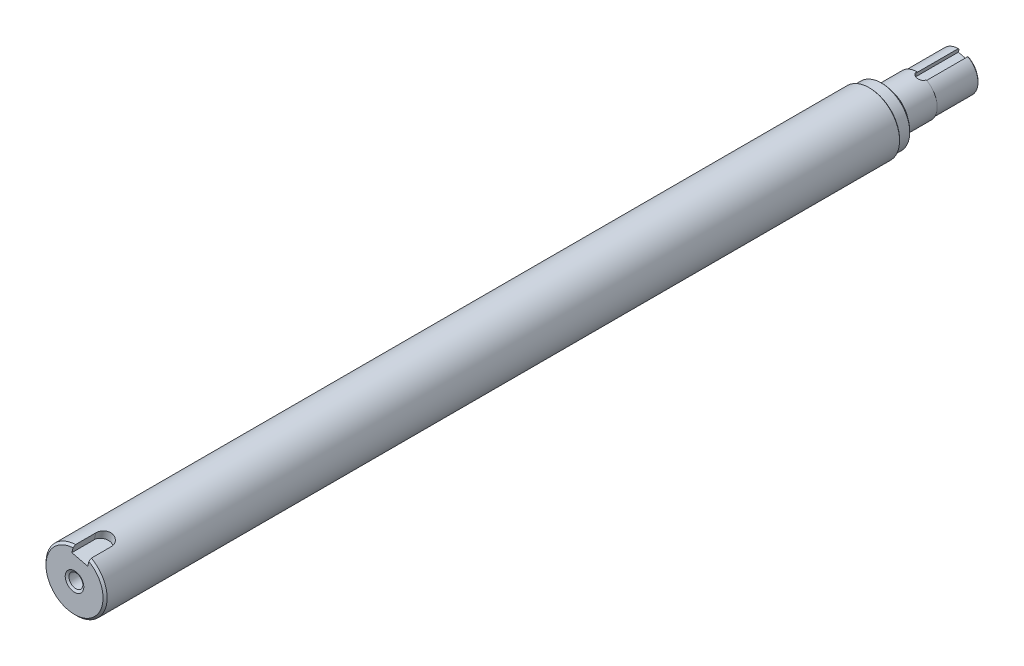
ISO-10303-21;
HEADER;
FILE_DESCRIPTION(('STEP AP214'),'2;1');
FILE_NAME('part.step','',(''),(''),'','','');
FILE_SCHEMA(('AUTOMOTIVE_DESIGN { 1 0 10303 214 1 1 1 1 }'));
ENDSEC;
DATA;
#1=APPLICATION_CONTEXT('core data for automotive mechanical design processes');
#2=APPLICATION_PROTOCOL_DEFINITION('international standard','automotive_design',2000,#1);
#3=PRODUCT_CONTEXT('',#1,'mechanical');
#4=PRODUCT('Part','Part','',(#3));
#5=PRODUCT_RELATED_PRODUCT_CATEGORY('part','',(#4));
#6=PRODUCT_DEFINITION_FORMATION('','',#4);
#7=PRODUCT_DEFINITION_CONTEXT('part definition',#1,'design');
#8=PRODUCT_DEFINITION('design','',#6,#7);
#9=PRODUCT_DEFINITION_SHAPE('','',#8);
#10=(LENGTH_UNIT() NAMED_UNIT(*) SI_UNIT(.MILLI.,.METRE.));
#11=(NAMED_UNIT(*) PLANE_ANGLE_UNIT() SI_UNIT($,.RADIAN.));
#12=(NAMED_UNIT(*) SI_UNIT($,.STERADIAN.) SOLID_ANGLE_UNIT());
#13=UNCERTAINTY_MEASURE_WITH_UNIT(LENGTH_MEASURE(1.E-05),#10,'distance_accuracy_value','');
#14=(GEOMETRIC_REPRESENTATION_CONTEXT(3) GLOBAL_UNCERTAINTY_ASSIGNED_CONTEXT((#13)) GLOBAL_UNIT_ASSIGNED_CONTEXT((#10,
#11,#12)) REPRESENTATION_CONTEXT('',''));
#15=CARTESIAN_POINT('',(0.,0.,0.));
#16=DIRECTION('',(0.,0.,1.));
#17=DIRECTION('',(1.,0.,0.));
#18=AXIS2_PLACEMENT_3D('',#15,#16,#17);
#19=CARTESIAN_POINT('',(521.923120033733,395.355248277508,-133.35));
#20=DIRECTION('',(0.,0.,1.));
#21=DIRECTION('',(1.,0.,0.));
#22=AXIS2_PLACEMENT_3D('',#19,#20,#21);
#23=PLANE('',#22);
#24=DIRECTION('',(0.234780935456965,0.972048307619509,0.));
#25=VECTOR('',#24,1.);
#26=CARTESIAN_POINT('',(475.867309140277,411.989768823581,-133.35));
#27=LINE('',#26,#25);
#28=CARTESIAN_POINT('',(475.867309140277,411.989768823581,-133.35));
#29=VERTEX_POINT('',#28);
#30=CARTESIAN_POINT('',(476.233688413175,413.50666520818,-133.35));
#31=VERTEX_POINT('',#30);
#32=EDGE_CURVE('E81',#29,#31,#27,.T.);
#33=ORIENTED_EDGE('',*,*,#32,.F.);
#34=DIRECTION('',(-0.972048307619508,0.234780935456973,0.));
#35=VECTOR('',#34,1.);
#36=CARTESIAN_POINT('',(475.867309140277,411.989768823581,-133.35));
#37=LINE('',#36,#35);
#38=CARTESIAN_POINT('',(480.496689205315,410.871624618467,-133.350000000002));
#39=VERTEX_POINT('',#38);
#40=EDGE_CURVE('E227',#39,#29,#37,.T.);
#41=ORIENTED_EDGE('',*,*,#40,.F.);
#42=DIRECTION('',(-0.23478093545618,-0.972048307619699,0.));
#43=VECTOR('',#42,1.);
#44=CARTESIAN_POINT('',(480.863068478212,412.388521003067,-133.35));
#45=LINE('',#44,#43);
#46=CARTESIAN_POINT('',(480.863068478213,412.388521003067,-133.35));
#47=VERTEX_POINT('',#46);
#48=EDGE_CURVE('E234',#47,#39,#45,.T.);
#49=ORIENTED_EDGE('',*,*,#48,.F.);
#50=CARTESIAN_POINT('',(476.510652388512,404.510927831157,-133.35));
#51=DIRECTION('',(0.,0.,1.));
#52=DIRECTION('',(1.,0.,0.));
#53=AXIS2_PLACEMENT_3D('',#50,#51,#52);
#54=CIRCLE('',#53,9.00000000000006);
#55=EDGE_CURVE('E19',#31,#47,#54,.T.);
#56=ORIENTED_EDGE('',*,*,#55,.F.);
#57=EDGE_LOOP('',(#33,#41,#49,#56));
#58=FACE_BOUND('',#57,.T.);
#59=ADVANCED_FACE('F16',(#58),#23,.F.);
#60=CARTESIAN_POINT('',(476.510652388512,404.510927831157,-132.85));
#61=DIRECTION('',(0.,0.,1.));
#62=DIRECTION('',(1.,0.,0.));
#63=AXIS2_PLACEMENT_3D('',#60,#61,#62);
#64=CONICAL_SURFACE('',#63,9.50000000000012,0.785398163397448);
#65=CARTESIAN_POINT('',(476.510652388512,404.510927831157,-132.85));
#66=DIRECTION('',(0.,0.,-1.));
#67=DIRECTION('',(-1.,0.,0.));
#68=AXIS2_PLACEMENT_3D('',#65,#66,#67);
#69=CIRCLE('',#68,9.5);
#70=CARTESIAN_POINT('',(476.355176748988,414.00965549993,-132.85));
#71=VERTEX_POINT('',#70);
#72=CARTESIAN_POINT('',(480.984556814026,412.891511294817,-132.85));
#73=VERTEX_POINT('',#72);
#74=EDGE_CURVE('E204',#71,#73,#69,.F.);
#75=ORIENTED_EDGE('',*,*,#74,.F.);
#76=CARTESIAN_POINT('',(476.233688413175,413.50666520818,-133.35));
#77=CARTESIAN_POINT('',(476.253955239274,413.590574636227,-133.26674940382));
#78=CARTESIAN_POINT('',(476.274212680371,413.674445208156,-133.183457438804));
#79=CARTESIAN_POINT('',(476.314708792309,413.842108638739,-133.016790772136));
#80=CARTESIAN_POINT('',(476.33494746315,413.925901497393,-132.933416070486));
#81=CARTESIAN_POINT('',(476.355176748988,414.00965549993,-132.85));
#82=B_SPLINE_CURVE_WITH_KNOTS('',3,(#76,#77,#78,#79,#80,#81),.UNSPECIFIED.,.F.,.F.,(4,2,4),(0.,
0.359777283505553,0.719554562536276),.UNSPECIFIED.);
#83=EDGE_CURVE('E214',#31,#71,#82,.T.);
#84=ORIENTED_EDGE('',*,*,#83,.F.);
#85=ORIENTED_EDGE('',*,*,#55,.T.);
#86=CARTESIAN_POINT('',(480.984556814027,412.891511294816,-132.85));
#87=CARTESIAN_POINT('',(480.964327528188,412.807757292279,-132.933416070486));
#88=CARTESIAN_POINT('',(480.944088857347,412.723964433625,-133.016790772136));
#89=CARTESIAN_POINT('',(480.903592745409,412.556301003042,-133.183457438805));
#90=CARTESIAN_POINT('',(480.883335304312,412.472430431112,-133.266749403821));
#91=CARTESIAN_POINT('',(480.863068478213,412.388521003065,-133.350000000001));
#92=B_SPLINE_CURVE_WITH_KNOTS('',3,(#86,#87,#88,#89,#90,#91),.UNSPECIFIED.,.F.,.F.,(4,2,4),(0.,
0.359777279031516,0.719554562537822),.UNSPECIFIED.);
#93=EDGE_CURVE('E221',#73,#47,#92,.T.);
#94=ORIENTED_EDGE('',*,*,#93,.F.);
#95=EDGE_LOOP('',(#75,#84,#85,#94));
#96=FACE_BOUND('',#95,.T.);
#97=ADVANCED_FACE('F371',(#96),#64,.T.);
#98=CARTESIAN_POINT('',(475.867309140277,411.989768823581,-133.35));
#99=DIRECTION('',(0.234780935456973,0.972048307619508,0.));
#100=DIRECTION('',(-0.972048307619508,0.234780935456973,0.));
#101=AXIS2_PLACEMENT_3D('',#98,#99,#100);
#102=PLANE('',#101);
#103=DIRECTION('',(0.,0.,1.));
#104=VECTOR('',#103,1.);
#105=CARTESIAN_POINT('',(475.867309140277,411.989768823581,-133.35));
#106=LINE('',#105,#104);
#107=CARTESIAN_POINT('',(475.867309140277,411.989768823581,-112.35));
#108=VERTEX_POINT('',#107);
#109=EDGE_CURVE('E211',#108,#29,#106,.F.);
#110=ORIENTED_EDGE('',*,*,#109,.F.);
#111=CARTESIAN_POINT('',(478.181999172796,411.430696721024,-112.35));
#112=DIRECTION('',(0.234780935456973,0.972048307619508,0.));
#113=DIRECTION('',(-0.972048307619508,0.234780935456973,0.));
#114=AXIS2_PLACEMENT_3D('',#111,#112,#113);
#115=CIRCLE('',#114,2.38124999999991);
#116=CARTESIAN_POINT('',(480.496689205315,410.871624618467,-112.35));
#117=VERTEX_POINT('',#116);
#118=EDGE_CURVE('E198',#108,#117,#115,.T.);
#119=ORIENTED_EDGE('',*,*,#118,.T.);
#120=DIRECTION('',(0.,0.,1.));
#121=VECTOR('',#120,1.);
#122=CARTESIAN_POINT('',(480.496689205315,410.871624618467,-133.35));
#123=LINE('',#122,#121);
#124=EDGE_CURVE('E215',#39,#117,#123,.T.);
#125=ORIENTED_EDGE('',*,*,#124,.F.);
#126=ORIENTED_EDGE('',*,*,#40,.T.);
#127=EDGE_LOOP('',(#110,#119,#125,#126));
#128=FACE_BOUND('',#127,.T.);
#129=ADVANCED_FACE('F374',(#128),#102,.T.);
#130=CARTESIAN_POINT('',(480.496689205315,410.871624618467,-133.35));
#131=DIRECTION('',(-0.972048307619507,0.234780935456974,0.));
#132=DIRECTION('',(-0.234780935456974,-0.972048307619507,0.));
#133=AXIS2_PLACEMENT_3D('',#130,#131,#132);
#134=PLANE('',#133);
#135=ORIENTED_EDGE('',*,*,#124,.T.);
#136=DIRECTION('',(0.234780935456973,0.972048307619508,0.));
#137=VECTOR('',#136,1.);
#138=CARTESIAN_POINT('',(480.496689205315,410.871624618467,-112.35));
#139=LINE('',#138,#137);
#140=CARTESIAN_POINT('',(480.984556814026,412.891511294817,-112.35));
#141=VERTEX_POINT('',#140);
#142=EDGE_CURVE('E195',#117,#141,#139,.T.);
#143=ORIENTED_EDGE('',*,*,#142,.T.);
#144=DIRECTION('',(0.,0.,-1.));
#145=VECTOR('',#144,1.);
#146=CARTESIAN_POINT('',(480.984556814026,412.891511294817,-133.35));
#147=LINE('',#146,#145);
#148=EDGE_CURVE('E199',#73,#141,#147,.F.);
#149=ORIENTED_EDGE('',*,*,#148,.F.);
#150=ORIENTED_EDGE('',*,*,#93,.T.);
#151=ORIENTED_EDGE('',*,*,#48,.T.);
#152=EDGE_LOOP('',(#135,#143,#149,#150,#151));
#153=FACE_BOUND('',#152,.T.);
#154=ADVANCED_FACE('F359',(#153),#134,.T.);
#155=CARTESIAN_POINT('',(476.426381242834,414.3044588561,-133.35));
#156=DIRECTION('',(0.972048307619507,-0.234780935456974,0.));
#157=DIRECTION('',(0.234780935456974,0.972048307619507,0.));
#158=AXIS2_PLACEMENT_3D('',#155,#156,#157);
#159=PLANE('',#158);
#160=DIRECTION('',(0.,0.,-1.));
#161=VECTOR('',#160,1.);
#162=CARTESIAN_POINT('',(476.355176748988,414.00965549993,-133.35));
#163=LINE('',#162,#161);
#164=CARTESIAN_POINT('',(476.355176748988,414.00965549993,-112.35));
#165=VERTEX_POINT('',#164);
#166=EDGE_CURVE('E203',#165,#71,#163,.T.);
#167=ORIENTED_EDGE('',*,*,#166,.F.);
#168=DIRECTION('',(0.234780935456973,0.972048307619508,0.));
#169=VECTOR('',#168,1.);
#170=CARTESIAN_POINT('',(475.867309140277,411.989768823581,-112.35));
#171=LINE('',#170,#169);
#172=EDGE_CURVE('E194',#165,#108,#171,.F.);
#173=ORIENTED_EDGE('',*,*,#172,.T.);
#174=ORIENTED_EDGE('',*,*,#109,.T.);
#175=ORIENTED_EDGE('',*,*,#32,.T.);
#176=ORIENTED_EDGE('',*,*,#83,.T.);
#177=EDGE_LOOP('',(#167,#173,#174,#175,#176));
#178=FACE_BOUND('',#177,.T.);
#179=ADVANCED_FACE('F354',(#178),#159,.T.);
#180=CARTESIAN_POINT('',(476.510652388512,404.510927831157,-133.35));
#181=DIRECTION('',(0.,0.,-1.));
#182=DIRECTION('',(-1.,0.,0.));
#183=AXIS2_PLACEMENT_3D('',#180,#181,#182);
#184=CYLINDRICAL_SURFACE('',#183,9.5);
#185=CARTESIAN_POINT('',(476.510652388512,404.510927831157,-112.35));
#186=DIRECTION('',(0.,0.,-1.));
#187=DIRECTION('',(-1.,0.,0.));
#188=AXIS2_PLACEMENT_3D('',#185,#186,#187);
#189=CIRCLE('',#188,9.5);
#190=EDGE_CURVE('E189',#165,#141,#189,.F.);
#191=ORIENTED_EDGE('',*,*,#190,.F.);
#192=ORIENTED_EDGE('',*,*,#166,.T.);
#193=ORIENTED_EDGE('',*,*,#74,.T.);
#194=ORIENTED_EDGE('',*,*,#148,.T.);
#195=EDGE_LOOP('',(#191,#192,#193,#194));
#196=FACE_BOUND('',#195,.T.);
#197=ADVANCED_FACE('F350',(#196),#184,.T.);
#198=CARTESIAN_POINT('',(478.181999172796,411.430696721024,-112.35));
#199=DIRECTION('',(0.234780935456973,0.972048307619508,0.));
#200=DIRECTION('',(-0.972048307619508,0.234780935456973,0.));
#201=AXIS2_PLACEMENT_3D('',#198,#199,#200);
#202=CYLINDRICAL_SURFACE('',#201,2.38124999999991);
#203=DIRECTION('',(-0.234780935456866,-0.972048307619533,0.));
#204=VECTOR('',#203,1.);
#205=CARTESIAN_POINT('',(476.470192018323,414.485845773599,-112.35));
#206=LINE('',#205,#204);
#207=CARTESIAN_POINT('',(476.470192018323,414.485845773599,-112.35));
#208=VERTEX_POINT('',#207);
#209=EDGE_CURVE('E190',#208,#165,#206,.T.);
#210=ORIENTED_EDGE('',*,*,#209,.F.);
#211=CARTESIAN_POINT('',(481.099572083361,413.367701568485,-112.35));
#212=CARTESIAN_POINT('',(481.099577756234,413.367693014945,-112.284046553238));
#213=CARTESIAN_POINT('',(481.097066818782,413.368999468537,-112.218097494663));
#214=CARTESIAN_POINT('',(481.08705634448,413.37417835744,-112.086690551702));
#215=CARTESIAN_POINT('',(481.079557591923,413.378050389335,-112.021232591732));
#216=CARTESIAN_POINT('',(481.059634669884,413.388286889518,-111.891390347162));
#217=CARTESIAN_POINT('',(481.047219708246,413.394646698041,-111.827004288529));
#218=CARTESIAN_POINT('',(481.017561252981,413.409729553551,-111.699654369686));
#219=CARTESIAN_POINT('',(481.000317704574,413.418452627351,-111.63669052562));
#220=CARTESIAN_POINT('',(480.941496867573,413.447940372555,-111.450596100208));
#221=CARTESIAN_POINT('',(480.892810327673,413.472033714611,-111.33013900872));
#222=CARTESIAN_POINT('',(480.777748237186,413.527388771429,-111.099854819844));
#223=CARTESIAN_POINT('',(480.711368651264,413.55865212126,-110.990030155242));
#224=CARTESIAN_POINT('',(480.561087755402,413.626931087084,-110.781878774471));
#225=CARTESIAN_POINT('',(480.476893458156,413.664039840316,-110.68379368951));
#226=CARTESIAN_POINT('',(480.293645987178,413.741282906621,-110.504047661653));
#227=CARTESIAN_POINT('',(480.194590463764,413.781417697636,-110.422389320748));
#228=CARTESIAN_POINT('',(479.982570235772,413.862903632084,-110.276832627482));
#229=CARTESIAN_POINT('',(479.869445566141,413.904263737523,-110.213171771507));
#230=CARTESIAN_POINT('',(479.633174384376,413.985423110078,-110.106963148855));
#231=CARTESIAN_POINT('',(479.510029728506,414.02522266428,-110.064411481891));
#232=CARTESIAN_POINT('',(479.259446208752,414.100586372214,-110.002399091028));
#233=CARTESIAN_POINT('',(479.132129205969,414.136215344289,-109.982525087069));
#234=CARTESIAN_POINT('',(478.874743237477,414.202643580588,-109.965136828242));
#235=CARTESIAN_POINT('',(478.744674584074,414.23344338961,-109.967620049319));
#236=CARTESIAN_POINT('',(478.488291370057,414.288781930374,-109.994575361315));
#237=CARTESIAN_POINT('',(478.361954129974,414.313434834425,-110.01860109176));
#238=CARTESIAN_POINT('',(478.113984563856,414.357034125103,-110.087244049606));
#239=CARTESIAN_POINT('',(477.9923524351,414.37598027268,-110.131862139402));
#240=CARTESIAN_POINT('',(477.756238223446,414.408577962033,-110.240797507248));
#241=CARTESIAN_POINT('',(477.641825098272,414.422183500043,-110.305277759111));
#242=CARTESIAN_POINT('',(477.424478427946,414.444582848067,-110.451982930794));
#243=CARTESIAN_POINT('',(477.321546431057,414.453376009742,-110.534210239478));
#244=CARTESIAN_POINT('',(477.127696255861,414.467311267538,-110.71647092732));
#245=CARTESIAN_POINT('',(477.037136155007,414.472358167071,-110.81689277427));
#246=CARTESIAN_POINT('',(476.873864303926,414.47964906536,-111.03147321963));
#247=CARTESIAN_POINT('',(476.801157428224,414.481892299304,-111.145635557002));
#248=CARTESIAN_POINT('',(476.675737257392,414.484760631114,-111.38515277278));
#249=CARTESIAN_POINT('',(476.623117973501,414.485378198252,-111.510556967665));
#250=CARTESIAN_POINT('',(476.540344287894,414.485970970364,-111.768479306729));
#251=CARTESIAN_POINT('',(476.510156374225,414.485947135568,-111.900986520313));
#252=CARTESIAN_POINT('',(476.48456304083,414.485895391744,-112.087183834043));
#253=CARTESIAN_POINT('',(476.479173218745,414.485878836865,-112.139646590204));
#254=CARTESIAN_POINT('',(476.471991759873,414.485853529017,-112.244731354237));
#255=CARTESIAN_POINT('',(476.470194234132,414.485844763293,-112.297352959609));
#256=CARTESIAN_POINT('',(476.470192018324,414.485845773599,-112.35));
#257=B_SPLINE_CURVE_WITH_KNOTS('',3,(#211,#212,#213,#214,#215,#216,#217,#218,#219,#220,#221,
#222,#223,#224,#225,#226,#227,#228,#229,#230,#231,#232,#233,#234,#235,#236,#237,#238,#239,#240,
#241,#242,#243,#244,#245,#246,#247,#248,#249,#250,#251,#252,#253,#254,#255,#256),.UNSPECIFIED.,
.F.,.F.,(4,2,2,2,2,2,2,2,2,2,2,2,2,2,2,2,2,2,2,2,2,2,4),(0.,0.197792036964074,0.395552980125366,
0.592945264466688,0.790339788310451,1.18475710502512,1.57926445540372,1.98084956528277,
2.38249823612323,2.78922300887172,3.19587260415187,3.59498669013254,3.99405571803728,
4.38504237712429,4.77604541194664,5.17034626230335,5.56470022112919,5.96876099473473,
6.37293196804019,6.77897195214247,7.18440409541634,7.34252337025762,7.5003832222773),.UNSPECIFIED.);
#258=CARTESIAN_POINT('',(481.099572083361,413.367701568485,-112.35));
#259=VERTEX_POINT('',#258);
#260=EDGE_CURVE('E188',#259,#208,#257,.T.);
#261=ORIENTED_EDGE('',*,*,#260,.F.);
#262=DIRECTION('',(0.234780935457358,0.972048307619415,0.));
#263=VECTOR('',#262,1.);
#264=CARTESIAN_POINT('',(480.984556814026,412.891511294817,-112.35));
#265=LINE('',#264,#263);
#266=EDGE_CURVE('E184',#141,#259,#265,.T.);
#267=ORIENTED_EDGE('',*,*,#266,.F.);
#268=ORIENTED_EDGE('',*,*,#142,.F.);
#269=ORIENTED_EDGE('',*,*,#118,.F.);
#270=ORIENTED_EDGE('',*,*,#172,.F.);
#271=EDGE_LOOP('',(#210,#261,#267,#268,#269,#270));
#272=FACE_BOUND('',#271,.T.);
#273=ADVANCED_FACE('F346',(#272),#202,.F.);
#274=CARTESIAN_POINT('',(478.572054776524,408.549876829984,-112.35));
#275=DIRECTION('',(0.,0.,-1.));
#276=DIRECTION('',(-1.,0.,0.));
#277=AXIS2_PLACEMENT_3D('',#274,#275,#276);
#278=PLANE('',#277);
#279=ORIENTED_EDGE('',*,*,#190,.T.);
#280=ORIENTED_EDGE('',*,*,#266,.T.);
#281=CARTESIAN_POINT('',(476.510652388512,404.510927831157,-112.35));
#282=DIRECTION('',(0.,0.,1.));
#283=DIRECTION('',(1.,0.,0.));
#284=AXIS2_PLACEMENT_3D('',#281,#282,#283);
#285=CIRCLE('',#284,9.975);
#286=EDGE_CURVE('E343',#208,#259,#285,.T.);
#287=ORIENTED_EDGE('',*,*,#286,.F.);
#288=ORIENTED_EDGE('',*,*,#209,.T.);
#289=EDGE_LOOP('',(#279,#280,#287,#288));
#290=FACE_BOUND('',#289,.T.);
#291=ADVANCED_FACE('F331',(#290),#278,.T.);
#292=CARTESIAN_POINT('',(476.510652388512,404.510927831157,-136.15));
#293=DIRECTION('',(0.,0.,1.));
#294=DIRECTION('',(1.,0.,0.));
#295=AXIS2_PLACEMENT_3D('',#292,#293,#294);
#296=CYLINDRICAL_SURFACE('',#295,9.975);
#297=CARTESIAN_POINT('',(476.510652388512,404.510927831157,-97.3499999999999));
#298=DIRECTION('',(0.,0.,1.));
#299=DIRECTION('',(1.,0.,0.));
#300=AXIS2_PLACEMENT_3D('',#297,#298,#299);
#301=CIRCLE('',#300,9.975);
#302=CARTESIAN_POINT('',(486.485652388512,404.510927831157,-97.3499999999999));
#303=VERTEX_POINT('',#302);
#304=EDGE_CURVE('E394',#303,#303,#301,.F.);
#305=ORIENTED_EDGE('',*,*,#304,.T.);
#306=EDGE_LOOP('',(#305));
#307=FACE_BOUND('',#306,.T.);
#308=ORIENTED_EDGE('',*,*,#286,.T.);
#309=ORIENTED_EDGE('',*,*,#260,.T.);
#310=EDGE_LOOP('',(#308,#309));
#311=FACE_BOUND('',#310,.T.);
#312=ADVANCED_FACE('F326',(#307,#311),#296,.T.);
#313=CARTESIAN_POINT('',(466.010652388512,404.510927831157,-97.3499999999999));
#314=DIRECTION('',(0.,0.,1.));
#315=DIRECTION('',(1.,0.,0.));
#316=AXIS2_PLACEMENT_3D('',#313,#314,#315);
#317=PLANE('',#316);
#318=CARTESIAN_POINT('',(476.510652388512,404.510927831157,-97.3499999999999));
#319=DIRECTION('',(0.,0.,1.));
#320=DIRECTION('',(1.,0.,0.));
#321=AXIS2_PLACEMENT_3D('',#318,#319,#320);
#322=CIRCLE('',#321,11.);
#323=CARTESIAN_POINT('',(487.510652388512,404.510927831157,-97.3499999999999));
#324=VERTEX_POINT('',#323);
#325=EDGE_CURVE('E403',#324,#324,#322,.T.);
#326=ORIENTED_EDGE('',*,*,#325,.F.);
#327=EDGE_LOOP('',(#326));
#328=FACE_BOUND('',#327,.T.);
#329=ORIENTED_EDGE('',*,*,#304,.F.);
#330=EDGE_LOOP('',(#329));
#331=FACE_BOUND('',#330,.T.);
#332=ADVANCED_FACE('F322',(#328,#331),#317,.F.);
#333=CARTESIAN_POINT('',(476.510652388512,404.510927831157,-96.3499999999999));
#334=DIRECTION('',(0.,0.,1.));
#335=DIRECTION('',(1.,0.,0.));
#336=AXIS2_PLACEMENT_3D('',#333,#334,#335);
#337=CYLINDRICAL_SURFACE('',#336,11.);
#338=CARTESIAN_POINT('',(476.510652388512,404.510927831157,-95.3499999999999));
#339=DIRECTION('',(0.,0.,1.));
#340=DIRECTION('',(1.,0.,0.));
#341=AXIS2_PLACEMENT_3D('',#338,#339,#340);
#342=CIRCLE('',#341,11.);
#343=CARTESIAN_POINT('',(487.510652388512,404.510927831157,-95.3499999999999));
#344=VERTEX_POINT('',#343);
#345=EDGE_CURVE('E183',#344,#344,#342,.F.);
#346=ORIENTED_EDGE('',*,*,#345,.T.);
#347=EDGE_LOOP('',(#346));
#348=FACE_BOUND('',#347,.T.);
#349=ORIENTED_EDGE('',*,*,#325,.T.);
#350=EDGE_LOOP('',(#349));
#351=FACE_BOUND('',#350,.T.);
#352=ADVANCED_FACE('F318',(#348,#351),#337,.T.);
#353=CARTESIAN_POINT('',(476.510652388512,404.510927831157,277.550000000019));
#354=DIRECTION('',(0.,0.,1.));
#355=DIRECTION('',(1.,0.,0.));
#356=AXIS2_PLACEMENT_3D('',#353,#354,#355);
#357=CONICAL_SURFACE('',#356,3.39999999998469,1.02974425867119);
#358=CARTESIAN_POINT('',(476.510652388441,404.510927831157,275.507073895341));
#359=VERTEX_POINT('',#358);
#360=VERTEX_LOOP('',#359);
#361=FACE_BOUND('',#360,.T.);
#362=CARTESIAN_POINT('',(476.510652388512,404.510927831157,277.55));
#363=DIRECTION('',(0.,0.,1.));
#364=DIRECTION('',(1.,0.,0.));
#365=AXIS2_PLACEMENT_3D('',#362,#363,#364);
#366=CIRCLE('',#365,3.4);
#367=CARTESIAN_POINT('',(479.910652388512,404.510927831157,277.55));
#368=VERTEX_POINT('',#367);
#369=EDGE_CURVE('E179',#368,#368,#366,.T.);
#370=ORIENTED_EDGE('',*,*,#369,.T.);
#371=EDGE_LOOP('',(#370));
#372=FACE_BOUND('',#371,.T.);
#373=ADVANCED_FACE('F314',(#361,#372),#357,.F.);
#374=CARTESIAN_POINT('',(464.010652388512,404.510927831157,-95.3499999999999));
#375=DIRECTION('',(0.,0.,1.));
#376=DIRECTION('',(1.,0.,0.));
#377=AXIS2_PLACEMENT_3D('',#374,#375,#376);
#378=PLANE('',#377);
#379=CARTESIAN_POINT('',(476.510652388512,404.510927831157,-95.3499999999999));
#380=DIRECTION('',(0.,0.,1.));
#381=DIRECTION('',(0.,-1.,0.));
#382=AXIS2_PLACEMENT_3D('',#379,#380,#381);
#383=CIRCLE('',#382,13.5);
#384=CARTESIAN_POINT('',(476.510652388512,391.010927831157,-95.3499999999999));
#385=VERTEX_POINT('',#384);
#386=EDGE_CURVE('E178',#385,#385,#383,.T.);
#387=ORIENTED_EDGE('',*,*,#386,.F.);
#388=EDGE_LOOP('',(#387));
#389=FACE_BOUND('',#388,.T.);
#390=ORIENTED_EDGE('',*,*,#345,.F.);
#391=EDGE_LOOP('',(#390));
#392=FACE_BOUND('',#391,.T.);
#393=ADVANCED_FACE('F310',(#389,#392),#378,.F.);
#394=CARTESIAN_POINT('',(476.510652388512,404.510927831157,-94.8499999999999));
#395=DIRECTION('',(0.,0.,1.));
#396=DIRECTION('',(0.,-1.,0.));
#397=AXIS2_PLACEMENT_3D('',#394,#395,#396);
#398=CONICAL_SURFACE('',#397,14.,0.785398163397462);
#399=ORIENTED_EDGE('',*,*,#386,.T.);
#400=EDGE_LOOP('',(#399));
#401=FACE_BOUND('',#400,.T.);
#402=CARTESIAN_POINT('',(476.510652388512,404.510927831157,-94.8499999999999));
#403=DIRECTION('',(0.,0.,1.));
#404=DIRECTION('',(1.,0.,0.));
#405=AXIS2_PLACEMENT_3D('',#402,#403,#404);
#406=CIRCLE('',#405,14.);
#407=CARTESIAN_POINT('',(490.510652388512,404.510927831157,-94.8499999999999));
#408=VERTEX_POINT('',#407);
#409=EDGE_CURVE('E174',#408,#408,#406,.T.);
#410=ORIENTED_EDGE('',*,*,#409,.F.);
#411=EDGE_LOOP('',(#410));
#412=FACE_BOUND('',#411,.T.);
#413=ADVANCED_FACE('F306',(#401,#412),#398,.T.);
#414=CARTESIAN_POINT('',(476.510652388512,404.510927831157,301.05));
#415=DIRECTION('',(0.,0.,1.));
#416=DIRECTION('',(1.,0.,0.));
#417=AXIS2_PLACEMENT_3D('',#414,#415,#416);
#418=CYLINDRICAL_SURFACE('',#417,3.4);
#419=ORIENTED_EDGE('',*,*,#369,.F.);
#420=EDGE_LOOP('',(#419));
#421=FACE_BOUND('',#420,.T.);
#422=CARTESIAN_POINT('',(476.510652388512,404.510927831157,300.37883031207));
#423=DIRECTION('',(0.,0.,1.));
#424=DIRECTION('',(-1.,0.,0.));
#425=AXIS2_PLACEMENT_3D('',#422,#423,#424);
#426=CIRCLE('',#425,3.40000000004154);
#427=CARTESIAN_POINT('',(473.11065238847,404.510927831157,300.37883031207));
#428=VERTEX_POINT('',#427);
#429=EDGE_CURVE('E170',#428,#428,#426,.T.);
#430=ORIENTED_EDGE('',*,*,#429,.T.);
#431=EDGE_LOOP('',(#430));
#432=FACE_BOUND('',#431,.T.);
#433=ADVANCED_FACE('F302',(#421,#432),#418,.F.);
#434=CARTESIAN_POINT('',(476.510652388512,404.510927831157,-92.8499999999999));
#435=DIRECTION('',(0.,0.,1.));
#436=DIRECTION('',(1.,0.,0.));
#437=AXIS2_PLACEMENT_3D('',#434,#435,#436);
#438=CYLINDRICAL_SURFACE('',#437,14.);
#439=CARTESIAN_POINT('',(476.510652388512,404.510927831157,-89.3499999999999));
#440=DIRECTION('',(0.,0.,1.));
#441=DIRECTION('',(1.,0.,0.));
#442=AXIS2_PLACEMENT_3D('',#439,#440,#441);
#443=CIRCLE('',#442,14.);
#444=CARTESIAN_POINT('',(490.510652388512,404.510927831157,-89.3499999999999));
#445=VERTEX_POINT('',#444);
#446=EDGE_CURVE('E163',#445,#445,#443,.F.);
#447=ORIENTED_EDGE('',*,*,#446,.T.);
#448=EDGE_LOOP('',(#447));
#449=FACE_BOUND('',#448,.T.);
#450=ORIENTED_EDGE('',*,*,#409,.T.);
#451=EDGE_LOOP('',(#450));
#452=FACE_BOUND('',#451,.T.);
#453=ADVANCED_FACE('F298',(#449,#452),#438,.T.);
#454=CARTESIAN_POINT('',(476.510652388512,404.510927831157,301.050000000032));
#455=DIRECTION('',(0.,0.,1.));
#456=DIRECTION('',(1.,0.,0.));
#457=AXIS2_PLACEMENT_3D('',#454,#455,#456);
#458=CONICAL_SURFACE('',#457,4.56250000006236,1.04719755117994);
#459=CARTESIAN_POINT('',(476.510652388512,404.510927831157,301.049999999975));
#460=DIRECTION('',(0.,0.,1.));
#461=DIRECTION('',(1.,0.,0.));
#462=AXIS2_PLACEMENT_3D('',#459,#460,#461);
#463=CIRCLE('',#462,4.56249999996317);
#464=CARTESIAN_POINT('',(481.073152388475,404.510927831157,301.049999999975));
#465=VERTEX_POINT('',#464);
#466=EDGE_CURVE('E138',#465,#465,#463,.F.);
#467=ORIENTED_EDGE('',*,*,#466,.F.);
#468=EDGE_LOOP('',(#467));
#469=FACE_BOUND('',#468,.T.);
#470=ORIENTED_EDGE('',*,*,#429,.F.);
#471=EDGE_LOOP('',(#470));
#472=FACE_BOUND('',#471,.T.);
#473=ADVANCED_FACE('F295',(#469,#472),#458,.F.);
#474=CARTESIAN_POINT('',(479.093242774892,415.203459613899,301.05));
#475=DIRECTION('',(0.234780935456973,0.972048307619508,0.));
#476=DIRECTION('',(-0.972048307619508,0.234780935456973,0.));
#477=AXIS2_PLACEMENT_3D('',#474,#475,#476);
#478=PLANE('',#477);
#479=CARTESIAN_POINT('',(479.093242774892,415.203459613899,290.05));
#480=DIRECTION('',(-0.234780935456973,-0.972048307619508,0.));
#481=DIRECTION('',(0.972048307619508,-0.234780935456973,0.));
#482=AXIS2_PLACEMENT_3D('',#479,#480,#481);
#483=CIRCLE('',#482,4.);
#484=CARTESIAN_POINT('',(482.98143600537,414.264335872071,290.05));
#485=VERTEX_POINT('',#484);
#486=CARTESIAN_POINT('',(475.205049544414,416.142583355727,290.05));
#487=VERTEX_POINT('',#486);
#488=EDGE_CURVE('E154',#485,#487,#483,.F.);
#489=ORIENTED_EDGE('',*,*,#488,.T.);
#490=DIRECTION('',(0.,0.,1.));
#491=VECTOR('',#490,1.);
#492=CARTESIAN_POINT('',(475.205049544414,416.142583355727,349.05));
#493=LINE('',#492,#491);
#494=CARTESIAN_POINT('',(475.205049544414,416.142583355727,301.05));
#495=VERTEX_POINT('',#494);
#496=EDGE_CURVE('E107',#487,#495,#493,.T.);
#497=ORIENTED_EDGE('',*,*,#496,.T.);
#498=DIRECTION('',(-0.972048307619501,0.234780935457,0.));
#499=VECTOR('',#498,1.);
#500=CARTESIAN_POINT('',(482.98143600537,414.264335872071,301.05));
#501=LINE('',#500,#499);
#502=CARTESIAN_POINT('',(482.98143600537,414.264335872071,301.05));
#503=VERTEX_POINT('',#502);
#504=EDGE_CURVE('E126',#503,#495,#501,.T.);
#505=ORIENTED_EDGE('',*,*,#504,.F.);
#506=DIRECTION('',(0.,0.,1.));
#507=VECTOR('',#506,1.);
#508=CARTESIAN_POINT('',(482.98143600537,414.264335872071,349.05));
#509=LINE('',#508,#507);
#510=EDGE_CURVE('E115',#485,#503,#509,.T.);
#511=ORIENTED_EDGE('',*,*,#510,.F.);
#512=EDGE_LOOP('',(#489,#497,#505,#511));
#513=FACE_BOUND('',#512,.T.);
#514=ADVANCED_FACE('F127',(#513),#478,.T.);
#515=CARTESIAN_POINT('',(462.010652388512,404.510927831157,-89.3499999999999));
#516=DIRECTION('',(0.,0.,1.));
#517=DIRECTION('',(1.,0.,0.));
#518=AXIS2_PLACEMENT_3D('',#515,#516,#517);
#519=PLANE('',#518);
#520=CARTESIAN_POINT('',(476.510652388511,404.510927831157,-89.3499999999999));
#521=DIRECTION('',(0.,0.,1.));
#522=DIRECTION('',(1.,0.,0.));
#523=AXIS2_PLACEMENT_3D('',#520,#521,#522);
#524=CIRCLE('',#523,14.5);
#525=CARTESIAN_POINT('',(491.010652388511,404.510927831157,-89.3499999999999));
#526=VERTEX_POINT('',#525);
#527=EDGE_CURVE('E253',#526,#526,#524,.T.);
#528=ORIENTED_EDGE('',*,*,#527,.F.);
#529=EDGE_LOOP('',(#528));
#530=FACE_BOUND('',#529,.T.);
#531=ORIENTED_EDGE('',*,*,#446,.F.);
#532=EDGE_LOOP('',(#531));
#533=FACE_BOUND('',#532,.T.);
#534=ADVANCED_FACE('F288',(#530,#533),#519,.F.);
#535=CARTESIAN_POINT('',(478.844153947643,431.209331724902,349.05));
#536=DIRECTION('',(-0.972048307619508,0.234780935456973,0.));
#537=DIRECTION('',(-0.234780935456973,-0.972048307619508,0.));
#538=AXIS2_PLACEMENT_3D('',#535,#536,#537);
#539=PLANE('',#538);
#540=DIRECTION('',(0.,0.,1.));
#541=VECTOR('',#540,1.);
#542=CARTESIAN_POINT('',(476.016647767951,419.502790938685,-88.9499999999999));
#543=LINE('',#542,#541);
#544=CARTESIAN_POINT('',(476.016647767951,419.502790938685,300.05));
#545=VERTEX_POINT('',#544);
#546=CARTESIAN_POINT('',(476.016647767951,419.502790938685,290.05));
#547=VERTEX_POINT('',#546);
#548=EDGE_CURVE('E252',#545,#547,#543,.F.);
#549=ORIENTED_EDGE('',*,*,#548,.F.);
#550=CARTESIAN_POINT('',(475.77237594705,418.49144813249,301.05));
#551=CARTESIAN_POINT('',(475.813143522097,418.660235484211,300.883579738666));
#552=CARTESIAN_POINT('',(475.85388329505,418.828907728719,300.717036273213));
#553=CARTESIAN_POINT('',(475.935307235348,419.166021997443,300.383702939871));
#554=CARTESIAN_POINT('',(475.975991402696,419.334464021666,300.216913071991));
#555=CARTESIAN_POINT('',(476.016647767951,419.502790938685,300.05));
#556=B_SPLINE_CURVE_WITH_KNOTS('',3,(#550,#551,#552,#553,#554,#555),.UNSPECIFIED.,.F.,.F.,(4,2,
4),(0.,0.721540733067441,1.44308144101344),.UNSPECIFIED.);
#557=CARTESIAN_POINT('',(475.77237594705,418.49144813249,301.05));
#558=VERTEX_POINT('',#557);
#559=EDGE_CURVE('E157',#558,#545,#556,.T.);
#560=ORIENTED_EDGE('',*,*,#559,.F.);
#561=DIRECTION('',(0.234780935456913,0.972048307619522,0.));
#562=VECTOR('',#561,1.);
#563=CARTESIAN_POINT('',(475.205049544414,416.142583355727,301.05));
#564=LINE('',#563,#562);
#565=EDGE_CURVE('E131',#495,#558,#564,.T.);
#566=ORIENTED_EDGE('',*,*,#565,.F.);
#567=ORIENTED_EDGE('',*,*,#496,.F.);
#568=DIRECTION('',(-0.234780935456973,-0.972048307619508,0.));
#569=VECTOR('',#568,1.);
#570=CARTESIAN_POINT('',(472.622459158033,405.450051572985,290.05));
#571=LINE('',#570,#569);
#572=EDGE_CURVE('E155',#487,#547,#571,.F.);
#573=ORIENTED_EDGE('',*,*,#572,.T.);
#574=EDGE_LOOP('',(#549,#560,#566,#567,#573));
#575=FACE_BOUND('',#574,.T.);
#576=ADVANCED_FACE('F284',(#575),#539,.F.);
#577=CARTESIAN_POINT('',(476.510652388511,404.510927831157,290.05));
#578=DIRECTION('',(-0.234780935456973,-0.972048307619508,0.));
#579=DIRECTION('',(0.972048307619508,-0.234780935456973,0.));
#580=AXIS2_PLACEMENT_3D('',#577,#578,#579);
#581=CYLINDRICAL_SURFACE('',#580,4.);
#582=CARTESIAN_POINT('',(476.016647767951,419.502790938685,290.05));
#583=CARTESIAN_POINT('',(476.016631914386,419.502781074588,289.9396418119));
#584=CARTESIAN_POINT('',(476.021383610062,419.502946759418,289.829291588656));
#585=CARTESIAN_POINT('',(476.040299998477,419.503557095511,289.609421565445));
#586=CARTESIAN_POINT('',(476.054462943061,419.504001694963,289.499901615076));
#587=CARTESIAN_POINT('',(476.092039405398,419.505096601389,289.282698614721));
#588=CARTESIAN_POINT('',(476.115432984719,419.505746464388,289.175012123969));
#589=CARTESIAN_POINT('',(476.171217420059,419.507112564947,288.962025242798));
#590=CARTESIAN_POINT('',(476.20360843393,419.50782880367,288.856724894276));
#591=CARTESIAN_POINT('',(476.313849944936,419.509819255175,288.545533039096));
#592=CARTESIAN_POINT('',(476.404809692872,419.510937052346,288.344118186089));
#593=CARTESIAN_POINT('',(476.61842300681,419.510918547295,287.958972925096));
#594=CARTESIAN_POINT('',(476.741085961503,419.509781576671,287.775247777956));
#595=CARTESIAN_POINT('',(477.017355344971,419.503016672704,287.426046634594));
#596=CARTESIAN_POINT('',(477.171592240762,419.497288907555,287.261070441054));
#597=CARTESIAN_POINT('',(477.504635799968,419.47888579218,286.95846910214));
#598=CARTESIAN_POINT('',(477.683451200186,419.466207966639,286.82085372533));
#599=CARTESIAN_POINT('',(478.063557206399,419.431566900732,286.574766863194));
#600=CARTESIAN_POINT('',(478.265168655433,419.409454605739,286.4668110477));
#601=CARTESIAN_POINT('',(478.68219563089,419.354392537007,286.286552409691));
#602=CARTESIAN_POINT('',(478.897594185039,419.3214558893,286.214206669099));
#603=CARTESIAN_POINT('',(479.267265918711,419.256253936387,286.124102463343));
#604=CARTESIAN_POINT('',(479.419706508219,419.226967961582,286.09636352257));
#605=CARTESIAN_POINT('',(479.72572871682,419.163153333157,286.059309076677));
#606=CARTESIAN_POINT('',(479.879310312051,419.128624788887,286.049993187347));
#607=CARTESIAN_POINT('',(480.246623981497,419.03989623512,286.05000953678));
#608=CARTESIAN_POINT('',(480.45985179005,418.983351116794,286.068287989712));
#609=CARTESIAN_POINT('',(480.878016141204,418.862709262055,286.140816679773));
#610=CARTESIAN_POINT('',(481.082944744257,418.798605513623,286.19510053787));
#611=CARTESIAN_POINT('',(481.478617428173,418.665885203767,286.337746164007));
#612=CARTESIAN_POINT('',(481.669382019058,418.597275449879,286.426057464058));
#613=CARTESIAN_POINT('',(482.03244885511,418.458958434363,286.634083040174));
#614=CARTESIAN_POINT('',(482.204751182604,418.389251177632,286.753797176198));
#615=CARTESIAN_POINT('',(482.53051078064,418.251134892411,287.024163375424));
#616=CARTESIAN_POINT('',(482.683500095143,418.182783256763,287.175408584444));
#617=CARTESIAN_POINT('',(482.963021424201,418.053111103203,287.503289930516));
#618=CARTESIAN_POINT('',(483.089548760853,417.991791829322,287.679930547625));
#619=CARTESIAN_POINT('',(483.315258314691,417.879307264915,288.057348861894));
#620=CARTESIAN_POINT('',(483.413924468874,417.828337973696,288.25849416884));
#621=CARTESIAN_POINT('',(483.578363657833,417.741806223893,288.676834501681));
#622=CARTESIAN_POINT('',(483.644162730795,417.706231572258,288.894016665663));
#623=CARTESIAN_POINT('',(483.725947965432,417.661630301825,289.268611270149));
#624=CARTESIAN_POINT('',(483.751070961933,417.647783501055,289.423527441284));
#625=CARTESIAN_POINT('',(483.784622306498,417.629215029661,289.735599999269));
#626=CARTESIAN_POINT('',(483.793060520445,417.624487966481,289.892755006861));
#627=CARTESIAN_POINT('',(483.793034228907,417.624543455029,290.05));
#628=B_SPLINE_CURVE_WITH_KNOTS('',3,(#582,#583,#584,#585,#586,#587,#588,#589,#590,#591,#592,
#593,#594,#595,#596,#597,#598,#599,#600,#601,#602,#603,#604,#605,#606,#607,#608,#609,#610,#611,
#612,#613,#614,#615,#616,#617,#618,#619,#620,#621,#622,#623,#624,#625,#626,#627),.UNSPECIFIED.,
.F.,.F.,(4,2,2,2,2,2,2,2,2,2,2,2,2,2,2,2,2,2,2,2,2,2,4),(0.,0.330958505034436,0.661855551220039,
0.992041729097123,1.32223370011404,1.98191826873151,2.64179842277408,3.31643087095954,
3.99130375063909,4.67725851959019,5.36238452345503,5.83435156357469,6.30630876079984,
6.96698411148035,7.62827725482655,8.28859334962562,8.94890649979825,9.62299055044445,
10.2971936639444,10.9831693222403,11.6686006667908,12.1401499051502,12.6114202281109),.UNSPECIFIED.);
#629=CARTESIAN_POINT('',(483.793034228907,417.624543455029,290.05));
#630=VERTEX_POINT('',#629);
#631=EDGE_CURVE('E101',#547,#630,#628,.T.);
#632=ORIENTED_EDGE('',*,*,#631,.F.);
#633=ORIENTED_EDGE('',*,*,#572,.F.);
#634=ORIENTED_EDGE('',*,*,#488,.F.);
#635=DIRECTION('',(-0.234780935456973,-0.972048307619508,0.));
#636=VECTOR('',#635,1.);
#637=CARTESIAN_POINT('',(486.620540408599,429.331084241246,290.05));
#638=LINE('',#637,#636);
#639=EDGE_CURVE('E121',#630,#485,#638,.T.);
#640=ORIENTED_EDGE('',*,*,#639,.F.);
#641=EDGE_LOOP('',(#632,#633,#634,#640));
#642=FACE_BOUND('',#641,.T.);
#643=ADVANCED_FACE('F254',(#642),#581,.F.);
#644=CARTESIAN_POINT('',(486.620540408599,429.331084241246,349.05));
#645=DIRECTION('',(-0.972048307619508,0.234780935456973,0.));
#646=DIRECTION('',(-0.234780935456973,-0.972048307619508,0.));
#647=AXIS2_PLACEMENT_3D('',#644,#645,#646);
#648=PLANE('',#647);
#649=CARTESIAN_POINT('',(483.548762408006,416.613200648835,301.05));
#650=CARTESIAN_POINT('',(483.589529983053,416.781988000555,300.883579738666));
#651=CARTESIAN_POINT('',(483.630269756006,416.950660245063,300.717036273213));
#652=CARTESIAN_POINT('',(483.711693696304,417.287774513787,300.383702939871));
#653=CARTESIAN_POINT('',(483.752377863652,417.45621653801,300.216913071991));
#654=CARTESIAN_POINT('',(483.793034228907,417.624543455029,300.05));
#655=B_SPLINE_CURVE_WITH_KNOTS('',3,(#649,#650,#651,#652,#653,#654),.UNSPECIFIED.,.F.,.F.,(4,2,
4),(0.,0.721540733067122,1.44308144101281),.UNSPECIFIED.);
#656=CARTESIAN_POINT('',(483.548762408006,416.613200648835,301.05));
#657=VERTEX_POINT('',#656);
#658=CARTESIAN_POINT('',(483.793034228907,417.62454345503,300.05));
#659=VERTEX_POINT('',#658);
#660=EDGE_CURVE('E123',#657,#659,#655,.T.);
#661=ORIENTED_EDGE('',*,*,#660,.T.);
#662=DIRECTION('',(0.,0.,1.));
#663=VECTOR('',#662,1.);
#664=CARTESIAN_POINT('',(483.793034228907,417.62454345503,-88.9499999999999));
#665=LINE('',#664,#663);
#666=EDGE_CURVE('E243',#630,#659,#665,.T.);
#667=ORIENTED_EDGE('',*,*,#666,.F.);
#668=ORIENTED_EDGE('',*,*,#639,.T.);
#669=ORIENTED_EDGE('',*,*,#510,.T.);
#670=DIRECTION('',(-0.234780935456797,-0.97204830761955,0.));
#671=VECTOR('',#670,1.);
#672=CARTESIAN_POINT('',(483.548762408006,416.613200648835,301.05));
#673=LINE('',#672,#671);
#674=EDGE_CURVE('E118',#657,#503,#673,.T.);
#675=ORIENTED_EDGE('',*,*,#674,.F.);
#676=EDGE_LOOP('',(#661,#667,#668,#669,#675));
#677=FACE_BOUND('',#676,.T.);
#678=ADVANCED_FACE('F116',(#677),#648,.T.);
#679=CARTESIAN_POINT('',(480.648152388511,404.510927831157,301.05));
#680=DIRECTION('',(0.,0.,1.));
#681=DIRECTION('',(1.,0.,0.));
#682=AXIS2_PLACEMENT_3D('',#679,#680,#681);
#683=PLANE('',#682);
#684=ORIENTED_EDGE('',*,*,#504,.T.);
#685=ORIENTED_EDGE('',*,*,#565,.T.);
#686=CARTESIAN_POINT('',(476.510652388511,404.510927831157,301.05));
#687=DIRECTION('',(0.,0.,-1.));
#688=DIRECTION('',(-1.,0.,0.));
#689=AXIS2_PLACEMENT_3D('',#686,#687,#688);
#690=CIRCLE('',#689,14.0000000000004);
#691=EDGE_CURVE('E136',#657,#558,#690,.T.);
#692=ORIENTED_EDGE('',*,*,#691,.F.);
#693=ORIENTED_EDGE('',*,*,#674,.T.);
#694=EDGE_LOOP('',(#684,#685,#692,#693));
#695=FACE_BOUND('',#694,.T.);
#696=ORIENTED_EDGE('',*,*,#466,.T.);
#697=EDGE_LOOP('',(#696));
#698=FACE_BOUND('',#697,.T.);
#699=ADVANCED_FACE('F133',(#695,#698),#683,.T.);
#700=CARTESIAN_POINT('',(476.510652388511,404.510927831157,-88.85));
#701=DIRECTION('',(0.,0.,1.));
#702=DIRECTION('',(1.,0.,0.));
#703=AXIS2_PLACEMENT_3D('',#700,#701,#702);
#704=CONICAL_SURFACE('',#703,15.,0.785398163397448);
#705=ORIENTED_EDGE('',*,*,#527,.T.);
#706=EDGE_LOOP('',(#705));
#707=FACE_BOUND('',#706,.T.);
#708=CARTESIAN_POINT('',(476.510652388511,404.510927831157,-88.8499999999999));
#709=DIRECTION('',(0.,0.,1.));
#710=DIRECTION('',(1.,0.,0.));
#711=AXIS2_PLACEMENT_3D('',#708,#709,#710);
#712=CIRCLE('',#711,15.);
#713=CARTESIAN_POINT('',(491.510652388511,404.510927831157,-88.8499999999999));
#714=VERTEX_POINT('',#713);
#715=EDGE_CURVE('E26',#714,#714,#712,.T.);
#716=ORIENTED_EDGE('',*,*,#715,.F.);
#717=EDGE_LOOP('',(#716));
#718=FACE_BOUND('',#717,.T.);
#719=ADVANCED_FACE('F267',(#707,#718),#704,.T.);
#720=CARTESIAN_POINT('',(476.510652388511,404.510927831157,300.05));
#721=DIRECTION('',(0.,0.,-1.));
#722=DIRECTION('',(-1.,0.,0.));
#723=AXIS2_PLACEMENT_3D('',#720,#721,#722);
#724=CONICAL_SURFACE('',#723,15.0000000000004,0.785398163397448);
#725=CARTESIAN_POINT('',(476.510652388511,404.510927831157,300.05));
#726=DIRECTION('',(0.,0.,1.));
#727=DIRECTION('',(1.,0.,0.));
#728=AXIS2_PLACEMENT_3D('',#725,#726,#727);
#729=CIRCLE('',#728,15.);
#730=EDGE_CURVE('E11',#659,#545,#729,.F.);
#731=ORIENTED_EDGE('',*,*,#730,.F.);
#732=ORIENTED_EDGE('',*,*,#660,.F.);
#733=ORIENTED_EDGE('',*,*,#691,.T.);
#734=ORIENTED_EDGE('',*,*,#559,.T.);
#735=EDGE_LOOP('',(#731,#732,#733,#734));
#736=FACE_BOUND('',#735,.T.);
#737=ADVANCED_FACE('F262',(#736),#724,.T.);
#738=CARTESIAN_POINT('',(476.510652388511,404.510927831157,-88.9499999999999));
#739=DIRECTION('',(0.,0.,1.));
#740=DIRECTION('',(1.,0.,0.));
#741=AXIS2_PLACEMENT_3D('',#738,#739,#740);
#742=CYLINDRICAL_SURFACE('',#741,15.);
#743=ORIENTED_EDGE('',*,*,#715,.T.);
#744=EDGE_LOOP('',(#743));
#745=FACE_BOUND('',#744,.T.);
#746=ORIENTED_EDGE('',*,*,#730,.T.);
#747=ORIENTED_EDGE('',*,*,#548,.T.);
#748=ORIENTED_EDGE('',*,*,#631,.T.);
#749=ORIENTED_EDGE('',*,*,#666,.T.);
#750=EDGE_LOOP('',(#746,#747,#748,#749));
#751=FACE_BOUND('',#750,.T.);
#752=ADVANCED_FACE('F258',(#745,#751),#742,.T.);
#753=CLOSED_SHELL('',(#59,#97,#129,#154,#179,#197,#273,#291,#312,#332,#352,#373,#393,#413,#433,
#453,#473,#514,#534,#576,#643,#678,#699,#719,#737,#752));
#754=MANIFOLD_SOLID_BREP('B1',#753);
#755=ADVANCED_BREP_SHAPE_REPRESENTATION('',(#18,#754),#14);
#756=SHAPE_DEFINITION_REPRESENTATION(#9,#755);
ENDSEC;
END-ISO-10303-21;
